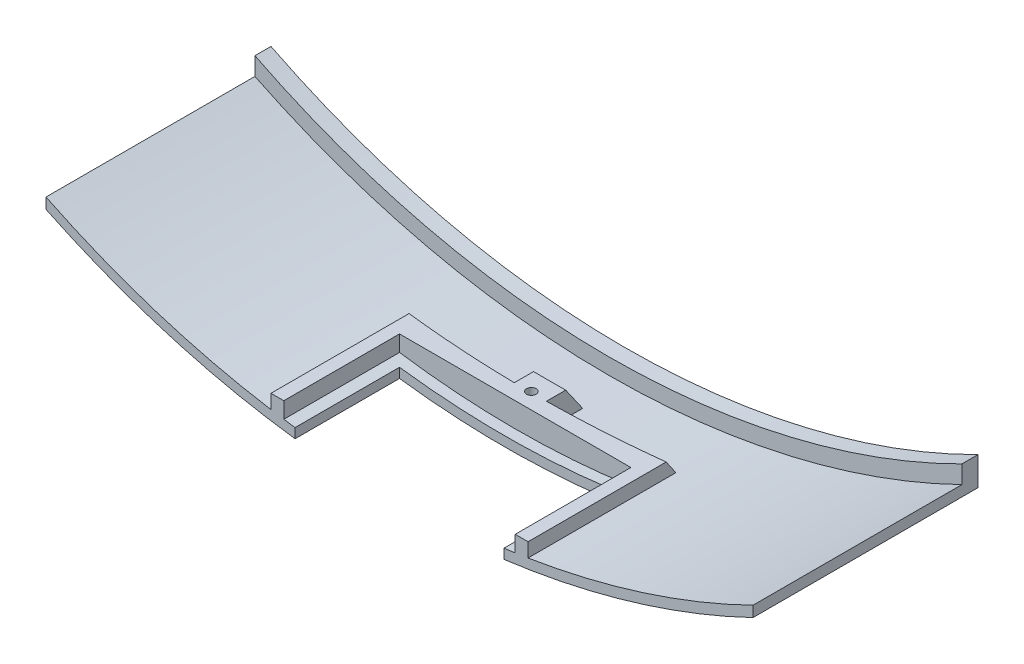
ISO-10303-21;
HEADER;
FILE_DESCRIPTION(('STEP AP214'),'2;1');
FILE_NAME('part.step','',(''),(''),'','','');
FILE_SCHEMA(('AUTOMOTIVE_DESIGN { 1 0 10303 214 1 1 1 1 }'));
ENDSEC;
DATA;
#1=APPLICATION_CONTEXT('core data for automotive mechanical design processes');
#2=APPLICATION_PROTOCOL_DEFINITION('international standard','automotive_design',2000,#1);
#3=PRODUCT_CONTEXT('',#1,'mechanical');
#4=PRODUCT('Part','Part','',(#3));
#5=PRODUCT_RELATED_PRODUCT_CATEGORY('part','',(#4));
#6=PRODUCT_DEFINITION_FORMATION('','',#4);
#7=PRODUCT_DEFINITION_CONTEXT('part definition',#1,'design');
#8=PRODUCT_DEFINITION('design','',#6,#7);
#9=PRODUCT_DEFINITION_SHAPE('','',#8);
#10=(LENGTH_UNIT() NAMED_UNIT(*) SI_UNIT(.MILLI.,.METRE.));
#11=(NAMED_UNIT(*) PLANE_ANGLE_UNIT() SI_UNIT($,.RADIAN.));
#12=(NAMED_UNIT(*) SI_UNIT($,.STERADIAN.) SOLID_ANGLE_UNIT());
#13=UNCERTAINTY_MEASURE_WITH_UNIT(LENGTH_MEASURE(1.E-05),#10,'distance_accuracy_value','');
#14=(GEOMETRIC_REPRESENTATION_CONTEXT(3) GLOBAL_UNCERTAINTY_ASSIGNED_CONTEXT((#13)) GLOBAL_UNIT_ASSIGNED_CONTEXT((#10,
#11,#12)) REPRESENTATION_CONTEXT('',''));
#15=CARTESIAN_POINT('',(0.,0.,0.));
#16=DIRECTION('',(0.,0.,1.));
#17=DIRECTION('',(1.,0.,0.));
#18=AXIS2_PLACEMENT_3D('',#15,#16,#17);
#19=CARTESIAN_POINT('',(0.,0.,140.));
#20=DIRECTION('',(0.,0.,-1.));
#21=DIRECTION('',(-1.,0.,0.));
#22=AXIS2_PLACEMENT_3D('',#19,#20,#21);
#23=CYLINDRICAL_SURFACE('',#22,250.);
#24=DIRECTION('',(0.,0.,-1.));
#25=VECTOR('',#24,1.);
#26=CARTESIAN_POINT('',(109.999999999993,-224.49944320644,140.));
#27=LINE('',#26,#25);
#28=CARTESIAN_POINT('',(109.999999999993,-224.49944320644,5.));
#29=VERTEX_POINT('',#28);
#30=CARTESIAN_POINT('',(109.999999999993,-224.49944320644,70.));
#31=VERTEX_POINT('',#30);
#32=EDGE_CURVE('E60',#29,#31,#27,.F.);
#33=ORIENTED_EDGE('',*,*,#32,.F.);
#34=CARTESIAN_POINT('',(0.,0.,5.));
#35=DIRECTION('',(0.,0.,-1.));
#36=DIRECTION('',(-1.,0.,0.));
#37=AXIS2_PLACEMENT_3D('',#34,#35,#36);
#38=CIRCLE('',#37,250.);
#39=CARTESIAN_POINT('',(-110.000000000007,-224.499443206433,5.));
#40=VERTEX_POINT('',#39);
#41=EDGE_CURVE('E205',#29,#40,#38,.T.);
#42=ORIENTED_EDGE('',*,*,#41,.T.);
#43=DIRECTION('',(0.,0.,-1.));
#44=VECTOR('',#43,1.);
#45=CARTESIAN_POINT('',(-110.000000000007,-224.499443206433,140.));
#46=LINE('',#45,#44);
#47=CARTESIAN_POINT('',(-110.000000000007,-224.499443206433,70.));
#48=VERTEX_POINT('',#47);
#49=EDGE_CURVE('E192',#48,#40,#46,.T.);
#50=ORIENTED_EDGE('',*,*,#49,.F.);
#51=CARTESIAN_POINT('',(0.,0.,70.));
#52=DIRECTION('',(0.,0.,-1.));
#53=DIRECTION('',(-1.,0.,0.));
#54=AXIS2_PLACEMENT_3D('',#51,#52,#53);
#55=CIRCLE('',#54,250.);
#56=CARTESIAN_POINT('',(-40.,-246.779253585061,70.));
#57=VERTEX_POINT('',#56);
#58=EDGE_CURVE('E202',#57,#48,#55,.T.);
#59=ORIENTED_EDGE('',*,*,#58,.F.);
#60=DIRECTION('',(0.,0.,-1.));
#61=VECTOR('',#60,1.);
#62=CARTESIAN_POINT('',(-40.,-246.779253585061,140.));
#63=LINE('',#62,#61);
#64=CARTESIAN_POINT('',(-40.,-246.779253585061,24.));
#65=VERTEX_POINT('',#64);
#66=EDGE_CURVE('E304',#65,#57,#63,.F.);
#67=ORIENTED_EDGE('',*,*,#66,.F.);
#68=CARTESIAN_POINT('',(0.,0.,24.));
#69=DIRECTION('',(0.,0.,-1.));
#70=DIRECTION('',(-1.,0.,0.));
#71=AXIS2_PLACEMENT_3D('',#68,#69,#70);
#72=CIRCLE('',#71,250.);
#73=CARTESIAN_POINT('',(-5.00000000000003,-249.949994999,24.));
#74=VERTEX_POINT('',#73);
#75=EDGE_CURVE('E372',#65,#74,#72,.F.);
#76=ORIENTED_EDGE('',*,*,#75,.T.);
#77=DIRECTION('',(0.,0.,-1.));
#78=VECTOR('',#77,1.);
#79=CARTESIAN_POINT('',(-5.00000000000003,-249.949994999,140.));
#80=LINE('',#79,#78);
#81=CARTESIAN_POINT('',(-5.00000000000003,-249.949994999,18.));
#82=VERTEX_POINT('',#81);
#83=EDGE_CURVE('E368',#74,#82,#80,.T.);
#84=ORIENTED_EDGE('',*,*,#83,.T.);
#85=CARTESIAN_POINT('',(0.,0.,18.));
#86=DIRECTION('',(0.,0.,-1.));
#87=DIRECTION('',(-1.,0.,0.));
#88=AXIS2_PLACEMENT_3D('',#85,#86,#87);
#89=CIRCLE('',#88,250.);
#90=CARTESIAN_POINT('',(4.99999999999997,-249.949994999,18.));
#91=VERTEX_POINT('',#90);
#92=EDGE_CURVE('E364',#82,#91,#89,.F.);
#93=ORIENTED_EDGE('',*,*,#92,.T.);
#94=DIRECTION('',(0.,0.,-1.));
#95=VECTOR('',#94,1.);
#96=CARTESIAN_POINT('',(4.99999999999997,-249.949994999,140.));
#97=LINE('',#96,#95);
#98=CARTESIAN_POINT('',(5.,-249.949994999,24.));
#99=VERTEX_POINT('',#98);
#100=EDGE_CURVE('E360',#91,#99,#97,.F.);
#101=ORIENTED_EDGE('',*,*,#100,.T.);
#102=CARTESIAN_POINT('',(0.,0.,24.));
#103=DIRECTION('',(0.,0.,-1.));
#104=DIRECTION('',(-1.,0.,0.));
#105=AXIS2_PLACEMENT_3D('',#102,#103,#104);
#106=CIRCLE('',#105,250.);
#107=CARTESIAN_POINT('',(40.,-246.779253585061,24.));
#108=VERTEX_POINT('',#107);
#109=EDGE_CURVE('E356',#99,#108,#106,.F.);
#110=ORIENTED_EDGE('',*,*,#109,.T.);
#111=DIRECTION('',(0.,0.,-1.));
#112=VECTOR('',#111,1.);
#113=CARTESIAN_POINT('',(40.,-246.779253585061,140.));
#114=LINE('',#113,#112);
#115=CARTESIAN_POINT('',(40.,-246.779253585061,70.));
#116=VERTEX_POINT('',#115);
#117=EDGE_CURVE('E307',#116,#108,#114,.T.);
#118=ORIENTED_EDGE('',*,*,#117,.F.);
#119=EDGE_CURVE('E216',#31,#116,#55,.T.);
#120=ORIENTED_EDGE('',*,*,#119,.F.);
#121=EDGE_LOOP('',(#33,#42,#50,#59,#67,#76,#84,#93,#101,#110,#118,#120));
#122=FACE_BOUND('',#121,.T.);
#123=ADVANCED_FACE('F42',(#122),#23,.F.);
#124=CARTESIAN_POINT('',(0.,0.,140.));
#125=DIRECTION('',(0.,0.,-1.));
#126=DIRECTION('',(-1.,0.,0.));
#127=AXIS2_PLACEMENT_3D('',#124,#125,#126);
#128=CYLINDRICAL_SURFACE('',#127,253.);
#129=CARTESIAN_POINT('',(0.,0.,0.));
#130=DIRECTION('',(0.,0.,1.));
#131=DIRECTION('',(1.,0.,0.));
#132=AXIS2_PLACEMENT_3D('',#129,#130,#131);
#133=CIRCLE('',#132,253.);
#134=CARTESIAN_POINT('',(-110.000000000007,-227.835466949284,0.));
#135=VERTEX_POINT('',#134);
#136=CARTESIAN_POINT('',(109.999999999993,-227.835466949291,0.));
#137=VERTEX_POINT('',#136);
#138=EDGE_CURVE('E334',#135,#137,#133,.T.);
#139=ORIENTED_EDGE('',*,*,#138,.T.);
#140=DIRECTION('',(0.,0.,-1.));
#141=VECTOR('',#140,1.);
#142=CARTESIAN_POINT('',(109.999999999993,-227.835466949291,140.));
#143=LINE('',#142,#141);
#144=CARTESIAN_POINT('',(109.999999999993,-227.835466949291,70.));
#145=VERTEX_POINT('',#144);
#146=EDGE_CURVE('E503',#137,#145,#143,.F.);
#147=ORIENTED_EDGE('',*,*,#146,.T.);
#148=CARTESIAN_POINT('',(0.,0.,70.));
#149=DIRECTION('',(0.,0.,-1.));
#150=DIRECTION('',(-1.,0.,0.));
#151=AXIS2_PLACEMENT_3D('',#148,#149,#150);
#152=CIRCLE('',#151,253.);
#153=CARTESIAN_POINT('',(32.5,-250.903866052319,70.));
#154=VERTEX_POINT('',#153);
#155=EDGE_CURVE('E224',#145,#154,#152,.T.);
#156=ORIENTED_EDGE('',*,*,#155,.T.);
#157=DIRECTION('',(0.,0.,-1.));
#158=VECTOR('',#157,1.);
#159=CARTESIAN_POINT('',(32.5,-250.903866052319,140.));
#160=LINE('',#159,#158);
#161=CARTESIAN_POINT('',(32.5000000000001,-250.903866052319,37.5));
#162=VERTEX_POINT('',#161);
#163=EDGE_CURVE('E349',#154,#162,#160,.T.);
#164=ORIENTED_EDGE('',*,*,#163,.T.);
#165=CARTESIAN_POINT('',(0.,0.,37.5));
#166=DIRECTION('',(0.,0.,-1.));
#167=DIRECTION('',(-1.,0.,0.));
#168=AXIS2_PLACEMENT_3D('',#165,#166,#167);
#169=CIRCLE('',#168,253.);
#170=CARTESIAN_POINT('',(-32.5,-250.903866052319,37.5));
#171=VERTEX_POINT('',#170);
#172=EDGE_CURVE('E341',#162,#171,#169,.T.);
#173=ORIENTED_EDGE('',*,*,#172,.T.);
#174=DIRECTION('',(0.,0.,-1.));
#175=VECTOR('',#174,1.);
#176=CARTESIAN_POINT('',(-32.5,-250.903866052319,140.));
#177=LINE('',#176,#175);
#178=CARTESIAN_POINT('',(-32.5,-250.903866052319,70.));
#179=VERTEX_POINT('',#178);
#180=EDGE_CURVE('E345',#171,#179,#177,.F.);
#181=ORIENTED_EDGE('',*,*,#180,.T.);
#182=CARTESIAN_POINT('',(-110.000000000007,-227.835466949284,70.));
#183=VERTEX_POINT('',#182);
#184=EDGE_CURVE('E214',#179,#183,#152,.T.);
#185=ORIENTED_EDGE('',*,*,#184,.T.);
#186=DIRECTION('',(0.,0.,-1.));
#187=VECTOR('',#186,1.);
#188=CARTESIAN_POINT('',(-110.000000000007,-227.835466949284,140.));
#189=LINE('',#188,#187);
#190=EDGE_CURVE('E67',#183,#135,#189,.T.);
#191=ORIENTED_EDGE('',*,*,#190,.T.);
#192=EDGE_LOOP('',(#139,#147,#156,#164,#173,#181,#185,#191));
#193=FACE_BOUND('',#192,.T.);
#194=ADVANCED_FACE('F492',(#193),#128,.T.);
#195=CARTESIAN_POINT('',(0.,0.,0.));
#196=DIRECTION('',(0.,0.,1.));
#197=DIRECTION('',(1.,0.,0.));
#198=AXIS2_PLACEMENT_3D('',#195,#196,#197);
#199=PLANE('',#198);
#200=CARTESIAN_POINT('',(0.,0.,0.));
#201=DIRECTION('',(0.,0.,-1.));
#202=DIRECTION('',(-1.,0.,0.));
#203=AXIS2_PLACEMENT_3D('',#200,#201,#202);
#204=CIRCLE('',#203,245.);
#205=CARTESIAN_POINT('',(109.999999999993,-218.9177927899,0.));
#206=VERTEX_POINT('',#205);
#207=CARTESIAN_POINT('',(-110.000000000007,-218.917792789893,0.));
#208=VERTEX_POINT('',#207);
#209=EDGE_CURVE('E327',#206,#208,#204,.T.);
#210=ORIENTED_EDGE('',*,*,#209,.F.);
#211=DIRECTION('',(0.,-1.,0.));
#212=VECTOR('',#211,1.);
#213=CARTESIAN_POINT('',(109.999999999993,0.,0.));
#214=LINE('',#213,#212);
#215=EDGE_CURVE('E509',#206,#137,#214,.T.);
#216=ORIENTED_EDGE('',*,*,#215,.T.);
#217=ORIENTED_EDGE('',*,*,#138,.F.);
#218=DIRECTION('',(0.,1.,0.));
#219=VECTOR('',#218,1.);
#220=CARTESIAN_POINT('',(-110.000000000007,0.,0.));
#221=LINE('',#220,#219);
#222=EDGE_CURVE('E508',#135,#208,#221,.T.);
#223=ORIENTED_EDGE('',*,*,#222,.T.);
#224=EDGE_LOOP('',(#210,#216,#217,#223));
#225=FACE_BOUND('',#224,.T.);
#226=ADVANCED_FACE('F488',(#225),#199,.F.);
#227=CARTESIAN_POINT('',(0.,0.,5.));
#228=DIRECTION('',(0.,0.,-1.));
#229=DIRECTION('',(-1.,0.,0.));
#230=AXIS2_PLACEMENT_3D('',#227,#228,#229);
#231=CYLINDRICAL_SURFACE('',#230,245.);
#232=CARTESIAN_POINT('',(0.,0.,5.));
#233=DIRECTION('',(0.,0.,-1.));
#234=DIRECTION('',(-1.,0.,0.));
#235=AXIS2_PLACEMENT_3D('',#232,#233,#234);
#236=CIRCLE('',#235,245.);
#237=CARTESIAN_POINT('',(109.999999999993,-218.9177927899,5.));
#238=VERTEX_POINT('',#237);
#239=CARTESIAN_POINT('',(-110.000000000007,-218.917792789893,5.));
#240=VERTEX_POINT('',#239);
#241=EDGE_CURVE('E328',#238,#240,#236,.T.);
#242=ORIENTED_EDGE('',*,*,#241,.F.);
#243=DIRECTION('',(0.,0.,-1.));
#244=VECTOR('',#243,1.);
#245=CARTESIAN_POINT('',(109.999999999993,-218.9177927899,5.));
#246=LINE('',#245,#244);
#247=EDGE_CURVE('E512',#238,#206,#246,.T.);
#248=ORIENTED_EDGE('',*,*,#247,.T.);
#249=ORIENTED_EDGE('',*,*,#209,.T.);
#250=DIRECTION('',(0.,0.,-1.));
#251=VECTOR('',#250,1.);
#252=CARTESIAN_POINT('',(-110.000000000007,-218.917792789893,4.99999999999998));
#253=LINE('',#252,#251);
#254=EDGE_CURVE('E529',#208,#240,#253,.F.);
#255=ORIENTED_EDGE('',*,*,#254,.T.);
#256=EDGE_LOOP('',(#242,#248,#249,#255));
#257=FACE_BOUND('',#256,.T.);
#258=ADVANCED_FACE('F484',(#257),#231,.F.);
#259=CARTESIAN_POINT('',(0.,0.,5.));
#260=DIRECTION('',(0.,0.,-1.));
#261=DIRECTION('',(-1.,0.,0.));
#262=AXIS2_PLACEMENT_3D('',#259,#260,#261);
#263=PLANE('',#262);
#264=ORIENTED_EDGE('',*,*,#41,.F.);
#265=DIRECTION('',(0.,1.,0.));
#266=VECTOR('',#265,1.);
#267=CARTESIAN_POINT('',(109.999999999993,0.,5.));
#268=LINE('',#267,#266);
#269=EDGE_CURVE('E517',#29,#238,#268,.T.);
#270=ORIENTED_EDGE('',*,*,#269,.T.);
#271=ORIENTED_EDGE('',*,*,#241,.T.);
#272=DIRECTION('',(0.,-1.,0.));
#273=VECTOR('',#272,1.);
#274=CARTESIAN_POINT('',(-110.000000000007,0.,5.));
#275=LINE('',#274,#273);
#276=EDGE_CURVE('E207',#240,#40,#275,.T.);
#277=ORIENTED_EDGE('',*,*,#276,.T.);
#278=EDGE_LOOP('',(#264,#270,#271,#277));
#279=FACE_BOUND('',#278,.T.);
#280=ADVANCED_FACE('F480',(#279),#263,.F.);
#281=CARTESIAN_POINT('',(-32.5,-212.816822643324,37.5));
#282=DIRECTION('',(-1.,0.,0.));
#283=DIRECTION('',(0.,0.,1.));
#284=AXIS2_PLACEMENT_3D('',#281,#282,#283);
#285=PLANE('',#284);
#286=DIRECTION('',(0.,0.,-1.));
#287=VECTOR('',#286,1.);
#288=CARTESIAN_POINT('',(-32.5,-247.878498462452,140.));
#289=LINE('',#288,#287);
#290=CARTESIAN_POINT('',(-32.5,-247.878498462452,37.5));
#291=VERTEX_POINT('',#290);
#292=CARTESIAN_POINT('',(-32.5,-247.878498462452,70.));
#293=VERTEX_POINT('',#292);
#294=EDGE_CURVE('E323',#291,#293,#289,.F.);
#295=ORIENTED_EDGE('',*,*,#294,.T.);
#296=DIRECTION('',(0.,-1.,0.));
#297=VECTOR('',#296,1.);
#298=CARTESIAN_POINT('',(-32.5,-212.816822643324,70.));
#299=LINE('',#298,#297);
#300=EDGE_CURVE('E222',#293,#179,#299,.T.);
#301=ORIENTED_EDGE('',*,*,#300,.T.);
#302=ORIENTED_EDGE('',*,*,#180,.F.);
#303=DIRECTION('',(0.,-1.,0.));
#304=VECTOR('',#303,1.);
#305=CARTESIAN_POINT('',(-32.5,-212.816822643324,37.5));
#306=LINE('',#305,#304);
#307=EDGE_CURVE('E310',#291,#171,#306,.T.);
#308=ORIENTED_EDGE('',*,*,#307,.F.);
#309=EDGE_LOOP('',(#295,#301,#302,#308));
#310=FACE_BOUND('',#309,.T.);
#311=ADVANCED_FACE('F476',(#310),#285,.F.);
#312=CARTESIAN_POINT('',(32.5,-212.816822643324,37.5));
#313=DIRECTION('',(0.,0.,-1.));
#314=DIRECTION('',(-1.,0.,0.));
#315=AXIS2_PLACEMENT_3D('',#312,#313,#314);
#316=PLANE('',#315);
#317=CARTESIAN_POINT('',(0.,0.,37.5));
#318=DIRECTION('',(0.,0.,-1.));
#319=DIRECTION('',(-1.,0.,0.));
#320=AXIS2_PLACEMENT_3D('',#317,#318,#319);
#321=CIRCLE('',#320,250.);
#322=CARTESIAN_POINT('',(32.5000000000001,-247.878498462452,37.5));
#323=VERTEX_POINT('',#322);
#324=EDGE_CURVE('E315',#323,#291,#321,.T.);
#325=ORIENTED_EDGE('',*,*,#324,.T.);
#326=ORIENTED_EDGE('',*,*,#307,.T.);
#327=ORIENTED_EDGE('',*,*,#172,.F.);
#328=DIRECTION('',(0.,-1.,0.));
#329=VECTOR('',#328,1.);
#330=CARTESIAN_POINT('',(32.5,-212.816822643324,37.5));
#331=LINE('',#330,#329);
#332=EDGE_CURVE('E311',#323,#162,#331,.T.);
#333=ORIENTED_EDGE('',*,*,#332,.F.);
#334=EDGE_LOOP('',(#325,#326,#327,#333));
#335=FACE_BOUND('',#334,.T.);
#336=ADVANCED_FACE('F473',(#335),#316,.F.);
#337=CARTESIAN_POINT('',(0.,0.,70.));
#338=DIRECTION('',(0.,0.,-1.));
#339=DIRECTION('',(-1.,0.,0.));
#340=AXIS2_PLACEMENT_3D('',#337,#338,#339);
#341=CIRCLE('',#340,250.);
#342=CARTESIAN_POINT('',(36.,-247.394421925798,70.));
#343=VERTEX_POINT('',#342);
#344=CARTESIAN_POINT('',(32.5,-247.878498462452,70.));
#345=VERTEX_POINT('',#344);
#346=EDGE_CURVE('E229',#343,#345,#341,.T.);
#347=ORIENTED_EDGE('',*,*,#346,.F.);
#348=DIRECTION('',(0.,0.,-1.));
#349=VECTOR('',#348,1.);
#350=CARTESIAN_POINT('',(36.,-247.394421925798,140.));
#351=LINE('',#350,#349);
#352=CARTESIAN_POINT('',(36.,-247.394421925798,34.));
#353=VERTEX_POINT('',#352);
#354=EDGE_CURVE('E297',#343,#353,#351,.T.);
#355=ORIENTED_EDGE('',*,*,#354,.T.);
#356=CARTESIAN_POINT('',(0.,0.,34.));
#357=DIRECTION('',(0.,0.,-1.));
#358=DIRECTION('',(-1.,0.,0.));
#359=AXIS2_PLACEMENT_3D('',#356,#357,#358);
#360=CIRCLE('',#359,250.);
#361=CARTESIAN_POINT('',(-36.,-247.394421925798,34.));
#362=VERTEX_POINT('',#361);
#363=EDGE_CURVE('E293',#353,#362,#360,.T.);
#364=ORIENTED_EDGE('',*,*,#363,.T.);
#365=DIRECTION('',(0.,0.,-1.));
#366=VECTOR('',#365,1.);
#367=CARTESIAN_POINT('',(-36.,-247.394421925798,140.));
#368=LINE('',#367,#366);
#369=CARTESIAN_POINT('',(-36.,-247.394421925798,70.));
#370=VERTEX_POINT('',#369);
#371=EDGE_CURVE('E300',#362,#370,#368,.F.);
#372=ORIENTED_EDGE('',*,*,#371,.T.);
#373=EDGE_CURVE('E237',#293,#370,#341,.T.);
#374=ORIENTED_EDGE('',*,*,#373,.F.);
#375=ORIENTED_EDGE('',*,*,#294,.F.);
#376=ORIENTED_EDGE('',*,*,#324,.F.);
#377=DIRECTION('',(0.,0.,-1.));
#378=VECTOR('',#377,1.);
#379=CARTESIAN_POINT('',(32.5,-247.878498462452,140.));
#380=LINE('',#379,#378);
#381=EDGE_CURVE('E320',#345,#323,#380,.T.);
#382=ORIENTED_EDGE('',*,*,#381,.F.);
#383=EDGE_LOOP('',(#347,#355,#364,#372,#374,#375,#376,#382));
#384=FACE_BOUND('',#383,.T.);
#385=ADVANCED_FACE('F471',(#384),#23,.F.);
#386=CARTESIAN_POINT('',(32.5,-212.816822643324,37.5));
#387=DIRECTION('',(1.,0.,0.));
#388=DIRECTION('',(0.,0.,-1.));
#389=AXIS2_PLACEMENT_3D('',#386,#387,#388);
#390=PLANE('',#389);
#391=ORIENTED_EDGE('',*,*,#163,.F.);
#392=DIRECTION('',(0.,1.,0.));
#393=VECTOR('',#392,1.);
#394=CARTESIAN_POINT('',(32.5,-212.816822643324,70.));
#395=LINE('',#394,#393);
#396=EDGE_CURVE('E228',#154,#345,#395,.T.);
#397=ORIENTED_EDGE('',*,*,#396,.T.);
#398=ORIENTED_EDGE('',*,*,#381,.T.);
#399=ORIENTED_EDGE('',*,*,#332,.T.);
#400=EDGE_LOOP('',(#391,#397,#398,#399));
#401=FACE_BOUND('',#400,.T.);
#402=ADVANCED_FACE('F468',(#401),#390,.F.);
#403=CARTESIAN_POINT('',(36.,-242.39,34.));
#404=DIRECTION('',(0.,0.,-1.));
#405=DIRECTION('',(-1.,0.,0.));
#406=AXIS2_PLACEMENT_3D('',#403,#404,#405);
#407=PLANE('',#406);
#408=ORIENTED_EDGE('',*,*,#363,.F.);
#409=DIRECTION('',(0.,-1.,0.));
#410=VECTOR('',#409,1.);
#411=CARTESIAN_POINT('',(36.,-242.39,34.));
#412=LINE('',#411,#410);
#413=CARTESIAN_POINT('',(36.,-242.39,34.));
#414=VERTEX_POINT('',#413);
#415=EDGE_CURVE('E280',#414,#353,#412,.T.);
#416=ORIENTED_EDGE('',*,*,#415,.F.);
#417=DIRECTION('',(1.,0.,0.));
#418=VECTOR('',#417,1.);
#419=CARTESIAN_POINT('',(36.,-242.39,34.));
#420=LINE('',#419,#418);
#421=CARTESIAN_POINT('',(-36.,-242.39,34.));
#422=VERTEX_POINT('',#421);
#423=EDGE_CURVE('E271',#422,#414,#420,.T.);
#424=ORIENTED_EDGE('',*,*,#423,.F.);
#425=DIRECTION('',(0.,-1.,0.));
#426=VECTOR('',#425,1.);
#427=CARTESIAN_POINT('',(-36.,-242.39,34.));
#428=LINE('',#427,#426);
#429=EDGE_CURVE('E279',#422,#362,#428,.T.);
#430=ORIENTED_EDGE('',*,*,#429,.T.);
#431=EDGE_LOOP('',(#408,#416,#424,#430));
#432=FACE_BOUND('',#431,.T.);
#433=ADVANCED_FACE('F466',(#432),#407,.F.);
#434=CARTESIAN_POINT('',(40.,-242.39,30.));
#435=DIRECTION('',(1.,0.,0.));
#436=DIRECTION('',(0.,1.,0.));
#437=AXIS2_PLACEMENT_3D('',#434,#435,#436);
#438=PLANE('',#437);
#439=DIRECTION('',(0.,1.,0.));
#440=VECTOR('',#439,1.);
#441=CARTESIAN_POINT('',(40.,-242.39,70.));
#442=LINE('',#441,#440);
#443=CARTESIAN_POINT('',(40.,-242.39,70.));
#444=VERTEX_POINT('',#443);
#445=EDGE_CURVE('E236',#116,#444,#442,.T.);
#446=ORIENTED_EDGE('',*,*,#445,.F.);
#447=ORIENTED_EDGE('',*,*,#117,.T.);
#448=CARTESIAN_POINT('',(40.,-246.779253585061,24.));
#449=CARTESIAN_POINT('',(40.,-246.047766587106,24.5055951713348));
#450=CARTESIAN_POINT('',(40.,-245.316251956049,25.0111503541952));
#451=CARTESIAN_POINT('',(40.,-243.853167427696,26.0221807429937));
#452=CARTESIAN_POINT('',(40.,-243.121597530398,26.5276559489317));
#453=CARTESIAN_POINT('',(40.,-242.39,27.0330911663953));
#454=B_SPLINE_CURVE_WITH_KNOTS('',3,(#448,#449,#450,#451,#452,#453),.UNSPECIFIED.,.F.,.F.,(4,2,
4),(0.,2.66763889709647,5.3352777943323),.UNSPECIFIED.);
#455=CARTESIAN_POINT('',(40.,-242.39,27.0330911663953));
#456=VERTEX_POINT('',#455);
#457=EDGE_CURVE('E198',#108,#456,#454,.T.);
#458=ORIENTED_EDGE('',*,*,#457,.T.);
#459=DIRECTION('',(0.,0.,1.));
#460=VECTOR('',#459,1.);
#461=CARTESIAN_POINT('',(40.,-242.39,30.));
#462=LINE('',#461,#460);
#463=EDGE_CURVE('E284',#456,#444,#462,.T.);
#464=ORIENTED_EDGE('',*,*,#463,.T.);
#465=EDGE_LOOP('',(#446,#447,#458,#464));
#466=FACE_BOUND('',#465,.T.);
#467=ADVANCED_FACE('F462',(#466),#438,.T.);
#468=CARTESIAN_POINT('',(-40.,-242.39,30.));
#469=DIRECTION('',(-1.,0.,0.));
#470=DIRECTION('',(0.,-1.,0.));
#471=AXIS2_PLACEMENT_3D('',#468,#469,#470);
#472=PLANE('',#471);
#473=DIRECTION('',(0.,-1.,0.));
#474=VECTOR('',#473,1.);
#475=CARTESIAN_POINT('',(-40.,-242.39,70.));
#476=LINE('',#475,#474);
#477=CARTESIAN_POINT('',(-40.,-242.39,70.));
#478=VERTEX_POINT('',#477);
#479=EDGE_CURVE('E211',#478,#57,#476,.T.);
#480=ORIENTED_EDGE('',*,*,#479,.F.);
#481=DIRECTION('',(0.,0.,-1.));
#482=VECTOR('',#481,1.);
#483=CARTESIAN_POINT('',(-40.,-242.39,30.));
#484=LINE('',#483,#482);
#485=CARTESIAN_POINT('',(-40.,-242.39,27.0330911663953));
#486=VERTEX_POINT('',#485);
#487=EDGE_CURVE('E290',#478,#486,#484,.T.);
#488=ORIENTED_EDGE('',*,*,#487,.T.);
#489=CARTESIAN_POINT('',(-40.,-242.39,27.0330911663953));
#490=CARTESIAN_POINT('',(-40.,-243.121597530398,26.5276559489317));
#491=CARTESIAN_POINT('',(-40.,-243.853167427696,26.0221807429937));
#492=CARTESIAN_POINT('',(-40.,-245.316251956049,25.0111503541952));
#493=CARTESIAN_POINT('',(-40.,-246.047766587106,24.5055951713348));
#494=CARTESIAN_POINT('',(-40.,-246.779253585061,24.));
#495=B_SPLINE_CURVE_WITH_KNOTS('',3,(#489,#490,#491,#492,#493,#494),.UNSPECIFIED.,.F.,.F.,(4,2,
4),(0.,2.66763889723582,5.33527779433231),.UNSPECIFIED.);
#496=EDGE_CURVE('E419',#486,#65,#495,.T.);
#497=ORIENTED_EDGE('',*,*,#496,.T.);
#498=ORIENTED_EDGE('',*,*,#66,.T.);
#499=EDGE_LOOP('',(#480,#488,#497,#498));
#500=FACE_BOUND('',#499,.T.);
#501=ADVANCED_FACE('F437',(#500),#472,.T.);
#502=CARTESIAN_POINT('',(0.,-242.39,0.));
#503=DIRECTION('',(0.,-1.,0.));
#504=DIRECTION('',(0.,0.,-1.));
#505=AXIS2_PLACEMENT_3D('',#502,#503,#504);
#506=PLANE('',#505);
#507=CARTESIAN_POINT('',(0.,-242.39,29.));
#508=DIRECTION('',(0.,1.,0.));
#509=DIRECTION('',(0.,0.,1.));
#510=AXIS2_PLACEMENT_3D('',#507,#508,#509);
#511=CIRCLE('',#510,1.5);
#512=CARTESIAN_POINT('',(0.,-242.39,30.5));
#513=VERTEX_POINT('',#512);
#514=EDGE_CURVE('E213',#513,#513,#511,.T.);
#515=ORIENTED_EDGE('',*,*,#514,.F.);
#516=EDGE_LOOP('',(#515));
#517=FACE_BOUND('',#516,.T.);
#518=ORIENTED_EDGE('',*,*,#487,.F.);
#519=DIRECTION('',(1.,0.,0.));
#520=VECTOR('',#519,1.);
#521=CARTESIAN_POINT('',(0.,-242.39,70.));
#522=LINE('',#521,#520);
#523=CARTESIAN_POINT('',(-36.,-242.39,70.));
#524=VERTEX_POINT('',#523);
#525=EDGE_CURVE('E250',#478,#524,#522,.T.);
#526=ORIENTED_EDGE('',*,*,#525,.T.);
#527=DIRECTION('',(0.,0.,-1.));
#528=VECTOR('',#527,1.);
#529=CARTESIAN_POINT('',(-36.,-242.39,34.));
#530=LINE('',#529,#528);
#531=EDGE_CURVE('E268',#524,#422,#530,.T.);
#532=ORIENTED_EDGE('',*,*,#531,.T.);
#533=ORIENTED_EDGE('',*,*,#423,.T.);
#534=DIRECTION('',(0.,0.,1.));
#535=VECTOR('',#534,1.);
#536=CARTESIAN_POINT('',(36.,-242.39,34.));
#537=LINE('',#536,#535);
#538=CARTESIAN_POINT('',(36.,-242.39,70.));
#539=VERTEX_POINT('',#538);
#540=EDGE_CURVE('E275',#414,#539,#537,.T.);
#541=ORIENTED_EDGE('',*,*,#540,.T.);
#542=EDGE_CURVE('E241',#539,#444,#522,.T.);
#543=ORIENTED_EDGE('',*,*,#542,.T.);
#544=ORIENTED_EDGE('',*,*,#463,.F.);
#545=CARTESIAN_POINT('',(40.,-242.39,27.0330911663953));
#546=CARTESIAN_POINT('',(38.5371997332752,-242.39,27.1998657498306));
#547=CARTESIAN_POINT('',(37.0734082797047,-242.39,27.3578416014223));
#548=CARTESIAN_POINT('',(34.1440060670293,-242.39,27.6559742425631));
#549=CARTESIAN_POINT('',(32.6783953002908,-242.39,27.7961309570897));
#550=CARTESIAN_POINT('',(28.2809746503457,-242.39,28.1893701003294));
#551=CARTESIAN_POINT('',(25.3467030990432,-242.39,28.4154356114596));
#552=CARTESIAN_POINT('',(19.5127007598546,-242.39,28.7915093299997));
#553=CARTESIAN_POINT('',(16.6130330548525,-242.39,28.9424946047877));
#554=CARTESIAN_POINT('',(12.2605476229217,-242.39,29.1146273527485));
#555=CARTESIAN_POINT('',(10.8087642346138,-242.39,29.1629540581133));
#556=CARTESIAN_POINT('',(7.90470273579022,-242.39,29.2413919627173));
#557=CARTESIAN_POINT('',(6.45242462430913,-242.39,29.2715031262004));
#558=CARTESIAN_POINT('',(5.,-242.39,29.2924736545469));
#559=B_SPLINE_CURVE_WITH_KNOTS('',3,(#545,#546,#547,#548,#549,#550,#551,#552,#553,#554,#555,
#556,#557,#558),.UNSPECIFIED.,.F.,.F.,(4,2,2,2,2,2,4),(0.,4.41677796939105,8.83357453376252,
17.6615126790338,26.3713466435965,30.7290087166154,35.0866793434682),.UNSPECIFIED.);
#560=CARTESIAN_POINT('',(5.,-242.39,29.2924736545469));
#561=VERTEX_POINT('',#560);
#562=EDGE_CURVE('E449',#456,#561,#559,.T.);
#563=ORIENTED_EDGE('',*,*,#562,.T.);
#564=DIRECTION('',(0.,0.,-1.));
#565=VECTOR('',#564,1.);
#566=CARTESIAN_POINT('',(5.,-242.39,24.));
#567=LINE('',#566,#565);
#568=CARTESIAN_POINT('',(5.,-242.39,23.2924736545469));
#569=VERTEX_POINT('',#568);
#570=EDGE_CURVE('E265',#561,#569,#567,.T.);
#571=ORIENTED_EDGE('',*,*,#570,.T.);
#572=CARTESIAN_POINT('',(5.,-242.39,23.2924736545469));
#573=CARTESIAN_POINT('',(3.33333333333333,-242.39,23.3165441286995));
#574=CARTESIAN_POINT('',(1.66666666666667,-242.39,23.3285793657758));
#575=CARTESIAN_POINT('',(-1.66666666666667,-242.39,23.3285793657758));
#576=CARTESIAN_POINT('',(-3.33333333333333,-242.39,23.3165441286995));
#577=CARTESIAN_POINT('',(-5.,-242.39,23.2924736545469));
#578=B_SPLINE_CURVE_WITH_KNOTS('',3,(#572,#573,#574,#575,#576,#577),.UNSPECIFIED.,.F.,.F.,(4,2,
4),(0.,5.00013036053895,10.0002607210779),.UNSPECIFIED.);
#579=CARTESIAN_POINT('',(-5.,-242.39,23.2924736545469));
#580=VERTEX_POINT('',#579);
#581=EDGE_CURVE('E444',#569,#580,#578,.T.);
#582=ORIENTED_EDGE('',*,*,#581,.T.);
#583=DIRECTION('',(0.,0.,1.));
#584=VECTOR('',#583,1.);
#585=CARTESIAN_POINT('',(-5.,-242.39,24.));
#586=LINE('',#585,#584);
#587=CARTESIAN_POINT('',(-5.,-242.39,29.2924736545469));
#588=VERTEX_POINT('',#587);
#589=EDGE_CURVE('E260',#580,#588,#586,.T.);
#590=ORIENTED_EDGE('',*,*,#589,.T.);
#591=CARTESIAN_POINT('',(-5.,-242.39,29.2924736545469));
#592=CARTESIAN_POINT('',(-6.45242462430913,-242.39,29.2715031262004));
#593=CARTESIAN_POINT('',(-7.90470273579021,-242.39,29.2413919627173));
#594=CARTESIAN_POINT('',(-10.8087642346137,-242.39,29.1629540581133));
#595=CARTESIAN_POINT('',(-12.2605476229217,-242.39,29.1146273527485));
#596=CARTESIAN_POINT('',(-16.6130330548525,-242.39,28.9424946047877));
#597=CARTESIAN_POINT('',(-19.5127007598545,-242.39,28.7915093299997));
#598=CARTESIAN_POINT('',(-25.3467030990431,-242.39,28.4154356114596));
#599=CARTESIAN_POINT('',(-28.2809746503456,-242.39,28.1893701003295));
#600=CARTESIAN_POINT('',(-32.6783953002908,-242.39,27.7961309570897));
#601=CARTESIAN_POINT('',(-34.1440060670292,-242.39,27.6559742425631));
#602=CARTESIAN_POINT('',(-37.0734082797047,-242.39,27.3578416014223));
#603=CARTESIAN_POINT('',(-38.5371997332751,-242.39,27.1998657498306));
#604=CARTESIAN_POINT('',(-40.,-242.39,27.0330911663953));
#605=B_SPLINE_CURVE_WITH_KNOTS('',3,(#591,#592,#593,#594,#595,#596,#597,#598,#599,#600,#601,
#602,#603,#604),.UNSPECIFIED.,.F.,.F.,(4,2,2,2,2,2,4),(0.,4.35767062685279,8.7153326998716,
17.4251666644343,26.2531048097056,30.669901374077,35.0866793434681),.UNSPECIFIED.);
#606=EDGE_CURVE('E410',#588,#486,#605,.T.);
#607=ORIENTED_EDGE('',*,*,#606,.T.);
#608=EDGE_LOOP('',(#518,#526,#532,#533,#541,#543,#544,#563,#571,#582,#590,#607));
#609=FACE_BOUND('',#608,.T.);
#610=ADVANCED_FACE('F432',(#517,#609),#506,.F.);
#611=CARTESIAN_POINT('',(-36.,-242.39,34.));
#612=DIRECTION('',(-1.,0.,0.));
#613=DIRECTION('',(0.,0.,1.));
#614=AXIS2_PLACEMENT_3D('',#611,#612,#613);
#615=PLANE('',#614);
#616=ORIENTED_EDGE('',*,*,#531,.F.);
#617=DIRECTION('',(0.,-1.,0.));
#618=VECTOR('',#617,1.);
#619=CARTESIAN_POINT('',(-36.,-242.39,70.));
#620=LINE('',#619,#618);
#621=EDGE_CURVE('E254',#524,#370,#620,.T.);
#622=ORIENTED_EDGE('',*,*,#621,.T.);
#623=ORIENTED_EDGE('',*,*,#371,.F.);
#624=ORIENTED_EDGE('',*,*,#429,.F.);
#625=EDGE_LOOP('',(#616,#622,#623,#624));
#626=FACE_BOUND('',#625,.T.);
#627=ADVANCED_FACE('F436',(#626),#615,.F.);
#628=CARTESIAN_POINT('',(36.,-242.39,34.));
#629=DIRECTION('',(1.,0.,0.));
#630=DIRECTION('',(0.,1.,0.));
#631=AXIS2_PLACEMENT_3D('',#628,#629,#630);
#632=PLANE('',#631);
#633=ORIENTED_EDGE('',*,*,#354,.F.);
#634=DIRECTION('',(0.,1.,0.));
#635=VECTOR('',#634,1.);
#636=CARTESIAN_POINT('',(36.,-242.39,70.));
#637=LINE('',#636,#635);
#638=EDGE_CURVE('E352',#343,#539,#637,.T.);
#639=ORIENTED_EDGE('',*,*,#638,.T.);
#640=ORIENTED_EDGE('',*,*,#540,.F.);
#641=ORIENTED_EDGE('',*,*,#415,.T.);
#642=EDGE_LOOP('',(#633,#639,#640,#641));
#643=FACE_BOUND('',#642,.T.);
#644=ADVANCED_FACE('F591',(#643),#632,.F.);
#645=CARTESIAN_POINT('',(5.,-250.39,24.));
#646=DIRECTION('',(1.,0.,0.));
#647=DIRECTION('',(0.,0.,-1.));
#648=AXIS2_PLACEMENT_3D('',#645,#646,#647);
#649=PLANE('',#648);
#650=ORIENTED_EDGE('',*,*,#570,.F.);
#651=CARTESIAN_POINT('',(5.,-242.39,29.2924736545469));
#652=CARTESIAN_POINT('',(5.,-243.650001791214,28.4103984613758));
#653=CARTESIAN_POINT('',(5.,-244.910002270071,27.5283213935779));
#654=CARTESIAN_POINT('',(5.,-247.430000603071,25.7641635087289));
#655=CARTESIAN_POINT('',(5.,-248.689998457214,24.8820826916778));
#656=CARTESIAN_POINT('',(5.,-249.949994999,23.9999999999999));
#657=B_SPLINE_CURVE_WITH_KNOTS('',3,(#651,#652,#653,#654,#655,#656),.UNSPECIFIED.,.F.,.F.,(4,2,
4),(0.,4.614211789926,9.22842357985174),.UNSPECIFIED.);
#658=EDGE_CURVE('E384',#561,#99,#657,.T.);
#659=ORIENTED_EDGE('',*,*,#658,.T.);
#660=ORIENTED_EDGE('',*,*,#100,.F.);
#661=CARTESIAN_POINT('',(4.99999999999997,-249.949994999,18.));
#662=CARTESIAN_POINT('',(4.99999999999998,-248.689998457214,18.8820826916778));
#663=CARTESIAN_POINT('',(5.,-247.430000603071,19.7641635087289));
#664=CARTESIAN_POINT('',(5.00000000000001,-244.910002270071,21.5283213935779));
#665=CARTESIAN_POINT('',(5.00000000000001,-243.650001791214,22.4103984613758));
#666=CARTESIAN_POINT('',(5.,-242.39,23.2924736545469));
#667=B_SPLINE_CURVE_WITH_KNOTS('',3,(#661,#662,#663,#664,#665,#666),.UNSPECIFIED.,.F.,.F.,(4,2,
4),(0.,4.61421178992573,9.22842357985174),.UNSPECIFIED.);
#668=EDGE_CURVE('E420',#91,#569,#667,.T.);
#669=ORIENTED_EDGE('',*,*,#668,.T.);
#670=EDGE_LOOP('',(#650,#659,#660,#669));
#671=FACE_BOUND('',#670,.T.);
#672=ADVANCED_FACE('F550',(#671),#649,.T.);
#673=CARTESIAN_POINT('',(-5.,-250.39,24.));
#674=DIRECTION('',(-1.,0.,0.));
#675=DIRECTION('',(0.,0.,1.));
#676=AXIS2_PLACEMENT_3D('',#673,#674,#675);
#677=PLANE('',#676);
#678=ORIENTED_EDGE('',*,*,#589,.F.);
#679=CARTESIAN_POINT('',(-5.,-242.39,23.2924736545469));
#680=CARTESIAN_POINT('',(-5.,-243.650001791214,22.4103984613758));
#681=CARTESIAN_POINT('',(-5.,-244.910002270071,21.5283213935779));
#682=CARTESIAN_POINT('',(-5.,-247.430000603071,19.7641635087289));
#683=CARTESIAN_POINT('',(-5.,-248.689998457214,18.8820826916778));
#684=CARTESIAN_POINT('',(-5.,-249.949994999,18.));
#685=B_SPLINE_CURVE_WITH_KNOTS('',3,(#679,#680,#681,#682,#683,#684),.UNSPECIFIED.,.F.,.F.,(4,2,
4),(0.,4.61421178992601,9.22842357985175),.UNSPECIFIED.);
#686=EDGE_CURVE('E556',#580,#82,#685,.T.);
#687=ORIENTED_EDGE('',*,*,#686,.T.);
#688=ORIENTED_EDGE('',*,*,#83,.F.);
#689=CARTESIAN_POINT('',(-5.00000000000003,-249.949994999,24.));
#690=CARTESIAN_POINT('',(-5.00000000000002,-248.689998457214,24.8820826916778));
#691=CARTESIAN_POINT('',(-5.00000000000001,-247.430000603071,25.7641635087289));
#692=CARTESIAN_POINT('',(-4.99999999999999,-244.910002270071,27.5283213935779));
#693=CARTESIAN_POINT('',(-4.99999999999999,-243.650001791214,28.4103984613758));
#694=CARTESIAN_POINT('',(-5.,-242.39,29.2924736545469));
#695=B_SPLINE_CURVE_WITH_KNOTS('',3,(#689,#690,#691,#692,#693,#694),.UNSPECIFIED.,.F.,.F.,(4,2,
4),(0.,4.61421178992573,9.22842357985174),.UNSPECIFIED.);
#696=EDGE_CURVE('E376',#74,#588,#695,.T.);
#697=ORIENTED_EDGE('',*,*,#696,.T.);
#698=EDGE_LOOP('',(#678,#687,#688,#697));
#699=FACE_BOUND('',#698,.T.);
#700=ADVANCED_FACE('F391',(#699),#677,.T.);
#701=CARTESIAN_POINT('',(0.,-247.39,29.));
#702=DIRECTION('',(0.,1.,0.));
#703=DIRECTION('',(0.,0.,1.));
#704=AXIS2_PLACEMENT_3D('',#701,#702,#703);
#705=CYLINDRICAL_SURFACE('',#704,1.5);
#706=CARTESIAN_POINT('',(0.,-247.39,29.));
#707=DIRECTION('',(0.,1.,0.));
#708=DIRECTION('',(0.,0.,1.));
#709=AXIS2_PLACEMENT_3D('',#706,#707,#708);
#710=CIRCLE('',#709,1.5);
#711=CARTESIAN_POINT('',(0.,-247.39,30.5));
#712=VERTEX_POINT('',#711);
#713=EDGE_CURVE('E220',#712,#712,#710,.T.);
#714=ORIENTED_EDGE('',*,*,#713,.F.);
#715=EDGE_LOOP('',(#714));
#716=FACE_BOUND('',#715,.T.);
#717=ORIENTED_EDGE('',*,*,#514,.T.);
#718=EDGE_LOOP('',(#717));
#719=FACE_BOUND('',#718,.T.);
#720=ADVANCED_FACE('F597',(#716,#719),#705,.F.);
#721=CARTESIAN_POINT('',(0.,-247.39,29.));
#722=DIRECTION('',(0.,1.,0.));
#723=DIRECTION('',(0.,0.,1.));
#724=AXIS2_PLACEMENT_3D('',#721,#722,#723);
#725=PLANE('',#724);
#726=ORIENTED_EDGE('',*,*,#713,.T.);
#727=EDGE_LOOP('',(#726));
#728=FACE_BOUND('',#727,.T.);
#729=ADVANCED_FACE('F651',(#728),#725,.T.);
#730=CARTESIAN_POINT('',(121.383689184338,-212.816822643324,70.));
#731=DIRECTION('',(0.,0.,-1.));
#732=DIRECTION('',(-1.,0.,0.));
#733=AXIS2_PLACEMENT_3D('',#730,#731,#732);
#734=PLANE('',#733);
#735=ORIENTED_EDGE('',*,*,#155,.F.);
#736=DIRECTION('',(0.,1.,0.));
#737=VECTOR('',#736,1.);
#738=CARTESIAN_POINT('',(109.999999999993,-212.816822643324,70.));
#739=LINE('',#738,#737);
#740=EDGE_CURVE('E11',#145,#31,#739,.T.);
#741=ORIENTED_EDGE('',*,*,#740,.T.);
#742=ORIENTED_EDGE('',*,*,#119,.T.);
#743=ORIENTED_EDGE('',*,*,#445,.T.);
#744=ORIENTED_EDGE('',*,*,#542,.F.);
#745=ORIENTED_EDGE('',*,*,#638,.F.);
#746=ORIENTED_EDGE('',*,*,#346,.T.);
#747=ORIENTED_EDGE('',*,*,#396,.F.);
#748=EDGE_LOOP('',(#735,#741,#742,#743,#744,#745,#746,#747));
#749=FACE_BOUND('',#748,.T.);
#750=ADVANCED_FACE('F647',(#749),#734,.F.);
#751=ORIENTED_EDGE('',*,*,#58,.T.);
#752=DIRECTION('',(0.,-1.,0.));
#753=VECTOR('',#752,1.);
#754=CARTESIAN_POINT('',(-110.000000000007,-212.816822643324,70.));
#755=LINE('',#754,#753);
#756=EDGE_CURVE('E53',#48,#183,#755,.T.);
#757=ORIENTED_EDGE('',*,*,#756,.T.);
#758=ORIENTED_EDGE('',*,*,#184,.F.);
#759=ORIENTED_EDGE('',*,*,#300,.F.);
#760=ORIENTED_EDGE('',*,*,#373,.T.);
#761=ORIENTED_EDGE('',*,*,#621,.F.);
#762=ORIENTED_EDGE('',*,*,#525,.F.);
#763=ORIENTED_EDGE('',*,*,#479,.T.);
#764=EDGE_LOOP('',(#751,#757,#758,#759,#760,#761,#762,#763));
#765=FACE_BOUND('',#764,.T.);
#766=ADVANCED_FACE('F209',(#765),#734,.F.);
#767=CARTESIAN_POINT('',(0.,0.,24.));
#768=DIRECTION('',(0.,0.,-1.));
#769=DIRECTION('',(-1.,0.,0.));
#770=AXIS2_PLACEMENT_3D('',#767,#768,#769);
#771=CONICAL_SURFACE('',#770,241.431111959547,0.959931088596886);
#772=ORIENTED_EDGE('',*,*,#668,.F.);
#773=ORIENTED_EDGE('',*,*,#92,.F.);
#774=ORIENTED_EDGE('',*,*,#686,.F.);
#775=ORIENTED_EDGE('',*,*,#581,.F.);
#776=EDGE_LOOP('',(#772,#773,#774,#775));
#777=FACE_BOUND('',#776,.T.);
#778=ADVANCED_FACE('F402',(#777),#771,.F.);
#779=CARTESIAN_POINT('',(0.,0.,30.));
#780=DIRECTION('',(0.,0.,-1.));
#781=DIRECTION('',(-1.,0.,0.));
#782=AXIS2_PLACEMENT_3D('',#779,#780,#781);
#783=CONICAL_SURFACE('',#782,241.431111959547,0.959931088596886);
#784=ORIENTED_EDGE('',*,*,#696,.F.);
#785=ORIENTED_EDGE('',*,*,#75,.F.);
#786=ORIENTED_EDGE('',*,*,#496,.F.);
#787=ORIENTED_EDGE('',*,*,#606,.F.);
#788=EDGE_LOOP('',(#784,#785,#786,#787));
#789=FACE_BOUND('',#788,.T.);
#790=ADVANCED_FACE('F395',(#789),#783,.F.);
#791=CARTESIAN_POINT('',(0.,0.,30.));
#792=DIRECTION('',(0.,0.,-1.));
#793=DIRECTION('',(-1.,0.,0.));
#794=AXIS2_PLACEMENT_3D('',#791,#792,#793);
#795=CONICAL_SURFACE('',#794,241.431111959547,0.959931088596886);
#796=ORIENTED_EDGE('',*,*,#457,.F.);
#797=ORIENTED_EDGE('',*,*,#109,.F.);
#798=ORIENTED_EDGE('',*,*,#658,.F.);
#799=ORIENTED_EDGE('',*,*,#562,.F.);
#800=EDGE_LOOP('',(#796,#797,#798,#799));
#801=FACE_BOUND('',#800,.T.);
#802=ADVANCED_FACE('F45',(#801),#795,.F.);
#803=CARTESIAN_POINT('',(-110.000000000007,-212.816822643324,151.022280658825));
#804=DIRECTION('',(1.,0.,0.));
#805=DIRECTION('',(0.,1.,0.));
#806=AXIS2_PLACEMENT_3D('',#803,#804,#805);
#807=PLANE('',#806);
#808=ORIENTED_EDGE('',*,*,#190,.F.);
#809=ORIENTED_EDGE('',*,*,#756,.F.);
#810=ORIENTED_EDGE('',*,*,#49,.T.);
#811=ORIENTED_EDGE('',*,*,#276,.F.);
#812=ORIENTED_EDGE('',*,*,#254,.F.);
#813=ORIENTED_EDGE('',*,*,#222,.F.);
#814=EDGE_LOOP('',(#808,#809,#810,#811,#812,#813));
#815=FACE_BOUND('',#814,.T.);
#816=ADVANCED_FACE('F191',(#815),#807,.F.);
#817=CARTESIAN_POINT('',(109.999999999993,-212.816822643324,-34.025251762241));
#818=DIRECTION('',(-1.,0.,0.));
#819=DIRECTION('',(0.,-1.,0.));
#820=AXIS2_PLACEMENT_3D('',#817,#818,#819);
#821=PLANE('',#820);
#822=ORIENTED_EDGE('',*,*,#247,.F.);
#823=ORIENTED_EDGE('',*,*,#269,.F.);
#824=ORIENTED_EDGE('',*,*,#32,.T.);
#825=ORIENTED_EDGE('',*,*,#740,.F.);
#826=ORIENTED_EDGE('',*,*,#146,.F.);
#827=ORIENTED_EDGE('',*,*,#215,.F.);
#828=EDGE_LOOP('',(#822,#823,#824,#825,#826,#827));
#829=FACE_BOUND('',#828,.T.);
#830=ADVANCED_FACE('F537',(#829),#821,.F.);
#831=CLOSED_SHELL('',(#123,#194,#226,#258,#280,#311,#336,#385,#402,#433,#467,#501,#610,#627,
#644,#672,#700,#720,#729,#750,#766,#778,#790,#802,#816,#830));
#832=MANIFOLD_SOLID_BREP('B2',#831);
#833=ADVANCED_BREP_SHAPE_REPRESENTATION('',(#18,#832),#14);
#834=SHAPE_DEFINITION_REPRESENTATION(#9,#833);
ENDSEC;
END-ISO-10303-21;
